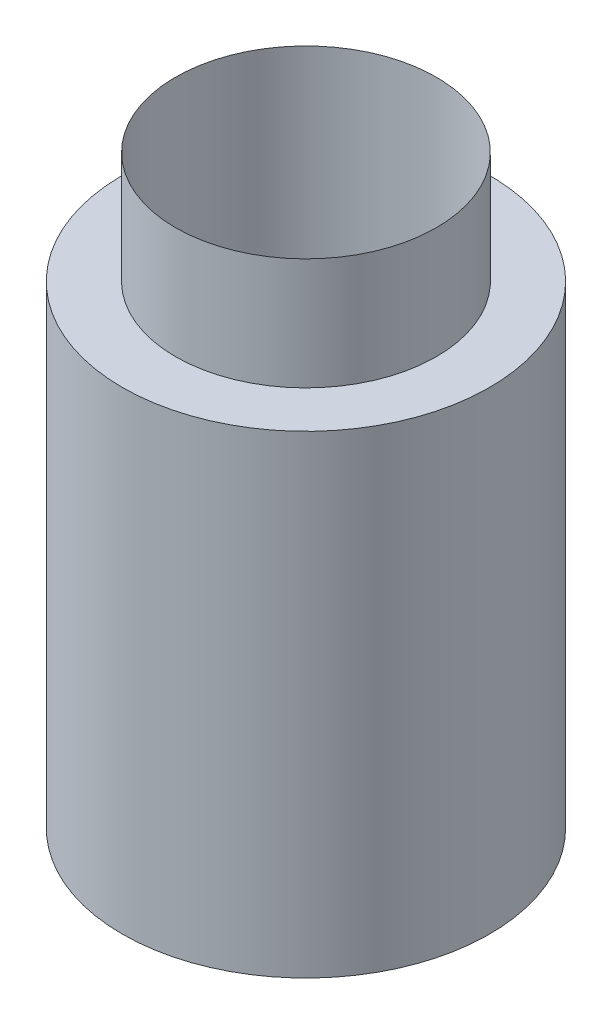
ISO-10303-21;
HEADER;
FILE_DESCRIPTION(('STEP AP214'),'2;1');
FILE_NAME('part.step','',(''),(''),'','','');
FILE_SCHEMA(('AUTOMOTIVE_DESIGN { 1 0 10303 214 1 1 1 1 }'));
ENDSEC;
DATA;
#1=APPLICATION_CONTEXT('core data for automotive mechanical design processes');
#2=APPLICATION_PROTOCOL_DEFINITION('international standard','automotive_design',2000,#1);
#3=PRODUCT_CONTEXT('',#1,'mechanical');
#4=PRODUCT('Part','Part','',(#3));
#5=PRODUCT_RELATED_PRODUCT_CATEGORY('part','',(#4));
#6=PRODUCT_DEFINITION_FORMATION('','',#4);
#7=PRODUCT_DEFINITION_CONTEXT('part definition',#1,'design');
#8=PRODUCT_DEFINITION('design','',#6,#7);
#9=PRODUCT_DEFINITION_SHAPE('','',#8);
#10=(LENGTH_UNIT() NAMED_UNIT(*) SI_UNIT(.MILLI.,.METRE.));
#11=(NAMED_UNIT(*) PLANE_ANGLE_UNIT() SI_UNIT($,.RADIAN.));
#12=(NAMED_UNIT(*) SI_UNIT($,.STERADIAN.) SOLID_ANGLE_UNIT());
#13=UNCERTAINTY_MEASURE_WITH_UNIT(LENGTH_MEASURE(1.E-05),#10,'distance_accuracy_value','');
#14=(GEOMETRIC_REPRESENTATION_CONTEXT(3) GLOBAL_UNCERTAINTY_ASSIGNED_CONTEXT((#13)) GLOBAL_UNIT_ASSIGNED_CONTEXT((#10,
#11,#12)) REPRESENTATION_CONTEXT('',''));
#15=CARTESIAN_POINT('',(0.,0.,0.));
#16=DIRECTION('',(0.,0.,1.));
#17=DIRECTION('',(1.,0.,0.));
#18=AXIS2_PLACEMENT_3D('',#15,#16,#17);
#19=CARTESIAN_POINT('',(0.,0.,0.));
#20=DIRECTION('',(0.,1.,0.));
#21=DIRECTION('',(0.,0.,1.));
#22=AXIS2_PLACEMENT_3D('',#19,#20,#21);
#23=CYLINDRICAL_SURFACE('',#22,24.5164081671551);
#24=CARTESIAN_POINT('',(0.,0.,0.));
#25=DIRECTION('',(0.,1.,0.));
#26=DIRECTION('',(0.,0.,1.));
#27=AXIS2_PLACEMENT_3D('',#24,#25,#26);
#28=CIRCLE('',#27,24.5164081671551);
#29=CARTESIAN_POINT('',(0.,0.,24.5164081671551));
#30=VERTEX_POINT('',#29);
#31=EDGE_CURVE('E57',#30,#30,#28,.T.);
#32=ORIENTED_EDGE('',*,*,#31,.T.);
#33=EDGE_LOOP('',(#32));
#34=FACE_BOUND('',#33,.T.);
#35=CARTESIAN_POINT('',(0.,110.,0.));
#36=DIRECTION('',(0.,1.,0.));
#37=DIRECTION('',(0.,0.,1.));
#38=AXIS2_PLACEMENT_3D('',#35,#36,#37);
#39=CIRCLE('',#38,24.5164081671551);
#40=CARTESIAN_POINT('',(0.,110.,24.5164081671551));
#41=VERTEX_POINT('',#40);
#42=EDGE_CURVE('E11',#41,#41,#39,.T.);
#43=ORIENTED_EDGE('',*,*,#42,.F.);
#44=EDGE_LOOP('',(#43));
#45=FACE_BOUND('',#44,.T.);
#46=ADVANCED_FACE('F53',(#34,#45),#23,.T.);
#47=OPEN_SHELL('',(#46));
#48=SHELL_BASED_SURFACE_MODEL('B2',(#47));
#49=CARTESIAN_POINT('',(0.,89.,0.));
#50=DIRECTION('',(0.,-1.,0.));
#51=DIRECTION('',(0.,0.,-1.));
#52=AXIS2_PLACEMENT_3D('',#49,#50,#51);
#53=CYLINDRICAL_SURFACE('',#52,24.5164081671551);
#54=CARTESIAN_POINT('',(0.,89.,0.));
#55=DIRECTION('',(0.,1.,0.));
#56=DIRECTION('',(0.,0.,1.));
#57=AXIS2_PLACEMENT_3D('',#54,#55,#56);
#58=CIRCLE('',#57,24.5164081671551);
#59=CARTESIAN_POINT('',(0.,89.,24.5164081671551));
#60=VERTEX_POINT('',#59);
#61=EDGE_CURVE('E82',#60,#60,#58,.T.);
#62=ORIENTED_EDGE('',*,*,#61,.T.);
#63=EDGE_LOOP('',(#62));
#64=FACE_BOUND('',#63,.T.);
#65=CARTESIAN_POINT('',(0.,0.,0.));
#66=DIRECTION('',(0.,1.,0.));
#67=DIRECTION('',(0.,0.,1.));
#68=AXIS2_PLACEMENT_3D('',#65,#66,#67);
#69=CIRCLE('',#68,24.5164081671551);
#70=CARTESIAN_POINT('',(0.,0.,24.5164081671551));
#71=VERTEX_POINT('',#70);
#72=EDGE_CURVE('E89',#71,#71,#69,.T.);
#73=ORIENTED_EDGE('',*,*,#72,.F.);
#74=EDGE_LOOP('',(#73));
#75=FACE_BOUND('',#74,.T.);
#76=ADVANCED_FACE('F74',(#64,#75),#53,.F.);
#77=CARTESIAN_POINT('',(0.,89.,0.));
#78=DIRECTION('',(0.,-1.,0.));
#79=DIRECTION('',(0.,0.,-1.));
#80=AXIS2_PLACEMENT_3D('',#77,#78,#79);
#81=CYLINDRICAL_SURFACE('',#80,34.5164081671551);
#82=CARTESIAN_POINT('',(0.,89.,0.));
#83=DIRECTION('',(0.,1.,0.));
#84=DIRECTION('',(0.,0.,1.));
#85=AXIS2_PLACEMENT_3D('',#82,#83,#84);
#86=CIRCLE('',#85,34.5164081671551);
#87=CARTESIAN_POINT('',(0.,89.,34.5164081671551));
#88=VERTEX_POINT('',#87);
#89=EDGE_CURVE('E52',#88,#88,#86,.T.);
#90=ORIENTED_EDGE('',*,*,#89,.F.);
#91=EDGE_LOOP('',(#90));
#92=FACE_BOUND('',#91,.T.);
#93=CARTESIAN_POINT('',(0.,0.,0.));
#94=DIRECTION('',(0.,1.,0.));
#95=DIRECTION('',(0.,0.,1.));
#96=AXIS2_PLACEMENT_3D('',#93,#94,#95);
#97=CIRCLE('',#96,34.5164081671551);
#98=CARTESIAN_POINT('',(0.,0.,34.5164081671551));
#99=VERTEX_POINT('',#98);
#100=EDGE_CURVE('E77',#99,#99,#97,.T.);
#101=ORIENTED_EDGE('',*,*,#100,.T.);
#102=EDGE_LOOP('',(#101));
#103=FACE_BOUND('',#102,.T.);
#104=ADVANCED_FACE('F98',(#92,#103),#81,.T.);
#105=CARTESIAN_POINT('',(0.,89.,0.));
#106=DIRECTION('',(0.,1.,0.));
#107=DIRECTION('',(0.,0.,1.));
#108=AXIS2_PLACEMENT_3D('',#105,#106,#107);
#109=PLANE('',#108);
#110=ORIENTED_EDGE('',*,*,#61,.F.);
#111=EDGE_LOOP('',(#110));
#112=FACE_BOUND('',#111,.T.);
#113=ORIENTED_EDGE('',*,*,#89,.T.);
#114=EDGE_LOOP('',(#113));
#115=FACE_BOUND('',#114,.T.);
#116=ADVANCED_FACE('F102',(#112,#115),#109,.T.);
#117=CARTESIAN_POINT('',(0.,0.,0.));
#118=DIRECTION('',(0.,1.,0.));
#119=DIRECTION('',(0.,0.,1.));
#120=AXIS2_PLACEMENT_3D('',#117,#118,#119);
#121=PLANE('',#120);
#122=ORIENTED_EDGE('',*,*,#72,.T.);
#123=EDGE_LOOP('',(#122));
#124=FACE_BOUND('',#123,.T.);
#125=ORIENTED_EDGE('',*,*,#100,.F.);
#126=EDGE_LOOP('',(#125));
#127=FACE_BOUND('',#126,.T.);
#128=ADVANCED_FACE('F100',(#124,#127),#121,.F.);
#129=CLOSED_SHELL('',(#76,#104,#116,#128));
#130=MANIFOLD_SOLID_BREP('B6',#129);
#131=ADVANCED_BREP_SHAPE_REPRESENTATION('',(#18,#130),#14);
#132=MANIFOLD_SURFACE_SHAPE_REPRESENTATION('',(#18,#48),#14);
#133=SHAPE_REPRESENTATION('',(#18),#14);
#134=SHAPE_DEFINITION_REPRESENTATION(#9,#133);
#135=SHAPE_REPRESENTATION_RELATIONSHIP('','',#133,#131);
#136=SHAPE_REPRESENTATION_RELATIONSHIP('','',#133,#132);
ENDSEC;
END-ISO-10303-21;
